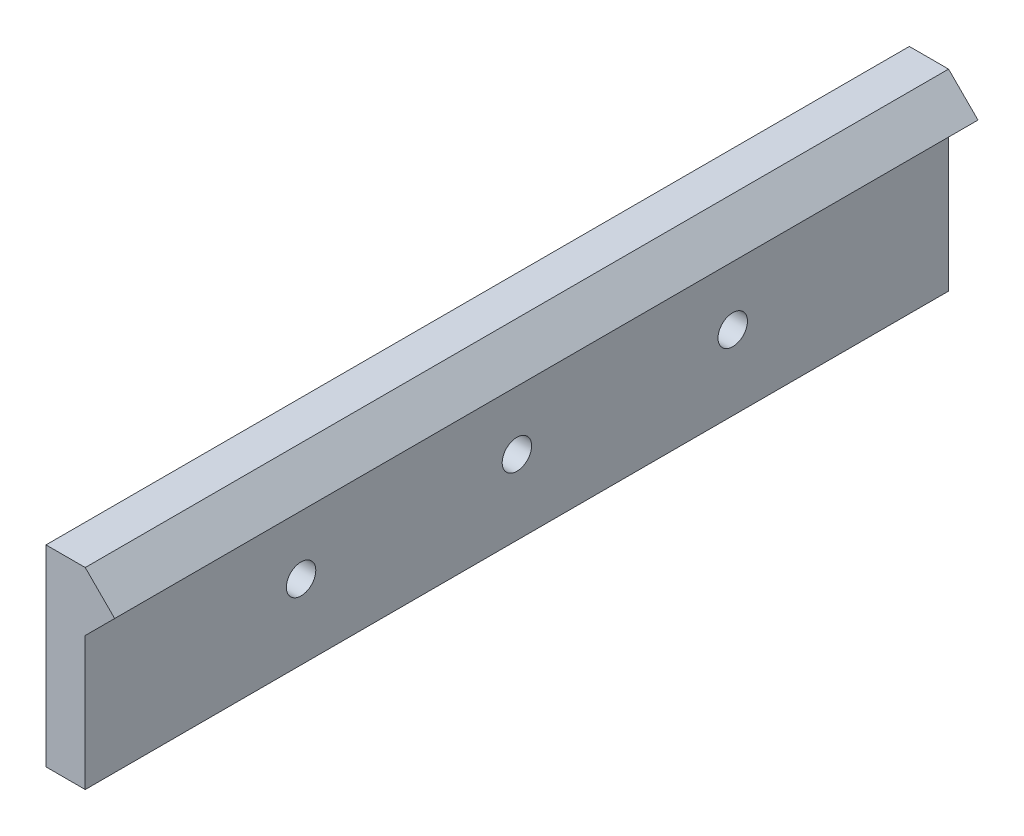
ISO-10303-21;
HEADER;
FILE_DESCRIPTION(('STEP AP214'),'2;1');
FILE_NAME('part.step','',(''),(''),'','','');
FILE_SCHEMA(('AUTOMOTIVE_DESIGN { 1 0 10303 214 1 1 1 1 }'));
ENDSEC;
DATA;
#1=APPLICATION_CONTEXT('core data for automotive mechanical design processes');
#2=APPLICATION_PROTOCOL_DEFINITION('international standard','automotive_design',2000,#1);
#3=PRODUCT_CONTEXT('',#1,'mechanical');
#4=PRODUCT('Part','Part','',(#3));
#5=PRODUCT_RELATED_PRODUCT_CATEGORY('part','',(#4));
#6=PRODUCT_DEFINITION_FORMATION('','',#4);
#7=PRODUCT_DEFINITION_CONTEXT('part definition',#1,'design');
#8=PRODUCT_DEFINITION('design','',#6,#7);
#9=PRODUCT_DEFINITION_SHAPE('','',#8);
#10=(LENGTH_UNIT() NAMED_UNIT(*) SI_UNIT(.MILLI.,.METRE.));
#11=(NAMED_UNIT(*) PLANE_ANGLE_UNIT() SI_UNIT($,.RADIAN.));
#12=(NAMED_UNIT(*) SI_UNIT($,.STERADIAN.) SOLID_ANGLE_UNIT());
#13=UNCERTAINTY_MEASURE_WITH_UNIT(LENGTH_MEASURE(1.E-05),#10,'distance_accuracy_value','');
#14=(GEOMETRIC_REPRESENTATION_CONTEXT(3) GLOBAL_UNCERTAINTY_ASSIGNED_CONTEXT((#13)) GLOBAL_UNIT_ASSIGNED_CONTEXT((#10,
#11,#12)) REPRESENTATION_CONTEXT('',''));
#15=CARTESIAN_POINT('',(0.,0.,0.));
#16=DIRECTION('',(0.,0.,1.));
#17=DIRECTION('',(1.,0.,0.));
#18=AXIS2_PLACEMENT_3D('',#15,#16,#17);
#19=CARTESIAN_POINT('',(6.35000000000002,44.45,139.7));
#20=DIRECTION('',(-1.,0.,0.));
#21=DIRECTION('',(0.,-1.,0.));
#22=AXIS2_PLACEMENT_3D('',#19,#20,#21);
#23=PLANE('',#22);
#24=CARTESIAN_POINT('',(6.35000000000002,25.4,69.85));
#25=DIRECTION('',(-1.,0.,0.));
#26=DIRECTION('',(0.,-1.,0.));
#27=AXIS2_PLACEMENT_3D('',#24,#25,#26);
#28=CIRCLE('',#27,4.7625);
#29=CARTESIAN_POINT('',(6.35000000000002,25.4,65.0875));
#30=VERTEX_POINT('',#29);
#31=EDGE_CURVE('E126',#30,#30,#28,.T.);
#32=ORIENTED_EDGE('',*,*,#31,.T.);
#33=EDGE_LOOP('',(#32));
#34=FACE_BOUND('',#33,.T.);
#35=CARTESIAN_POINT('',(6.35000000000002,25.4,0.));
#36=DIRECTION('',(-1.,0.,0.));
#37=DIRECTION('',(0.,-1.,0.));
#38=AXIS2_PLACEMENT_3D('',#35,#36,#37);
#39=CIRCLE('',#38,4.7625);
#40=CARTESIAN_POINT('',(6.35000000000002,25.4,-4.76250000000003));
#41=VERTEX_POINT('',#40);
#42=EDGE_CURVE('E144',#41,#41,#39,.T.);
#43=ORIENTED_EDGE('',*,*,#42,.T.);
#44=EDGE_LOOP('',(#43));
#45=FACE_BOUND('',#44,.T.);
#46=CARTESIAN_POINT('',(6.35000000000002,25.4,-69.85));
#47=DIRECTION('',(-1.,0.,0.));
#48=DIRECTION('',(0.,-1.,0.));
#49=AXIS2_PLACEMENT_3D('',#46,#47,#48);
#50=CIRCLE('',#49,4.7625);
#51=CARTESIAN_POINT('',(6.35000000000002,25.4,-74.6125));
#52=VERTEX_POINT('',#51);
#53=EDGE_CURVE('E141',#52,#52,#50,.T.);
#54=ORIENTED_EDGE('',*,*,#53,.T.);
#55=EDGE_LOOP('',(#54));
#56=FACE_BOUND('',#55,.T.);
#57=DIRECTION('',(0.,1.,0.));
#58=VECTOR('',#57,1.);
#59=CARTESIAN_POINT('',(6.35000000000002,44.45,-139.7));
#60=LINE('',#59,#58);
#61=CARTESIAN_POINT('',(6.35000000000002,1.27,-139.7));
#62=VERTEX_POINT('',#61);
#63=CARTESIAN_POINT('',(6.35000000000002,44.45,-139.7));
#64=VERTEX_POINT('',#63);
#65=EDGE_CURVE('E122',#62,#64,#60,.T.);
#66=ORIENTED_EDGE('',*,*,#65,.T.);
#67=DIRECTION('',(0.,0.,-1.));
#68=VECTOR('',#67,1.);
#69=CARTESIAN_POINT('',(6.35000000000002,44.45,139.7));
#70=LINE('',#69,#68);
#71=CARTESIAN_POINT('',(6.35000000000002,44.45,139.7));
#72=VERTEX_POINT('',#71);
#73=EDGE_CURVE('E11',#72,#64,#70,.T.);
#74=ORIENTED_EDGE('',*,*,#73,.F.);
#75=DIRECTION('',(0.,1.,0.));
#76=VECTOR('',#75,1.);
#77=CARTESIAN_POINT('',(6.35000000000002,44.45,139.7));
#78=LINE('',#77,#76);
#79=CARTESIAN_POINT('',(6.35000000000002,1.27,139.7));
#80=VERTEX_POINT('',#79);
#81=EDGE_CURVE('E133',#80,#72,#78,.T.);
#82=ORIENTED_EDGE('',*,*,#81,.F.);
#83=DIRECTION('',(0.,0.,-1.));
#84=VECTOR('',#83,1.);
#85=CARTESIAN_POINT('',(6.35000000000002,1.27,139.7));
#86=LINE('',#85,#84);
#87=EDGE_CURVE('E118',#80,#62,#86,.T.);
#88=ORIENTED_EDGE('',*,*,#87,.T.);
#89=EDGE_LOOP('',(#66,#74,#82,#88));
#90=FACE_BOUND('',#89,.T.);
#91=ADVANCED_FACE('F36',(#34,#45,#56,#90),#23,.F.);
#92=CARTESIAN_POINT('',(6.35000000000002,44.45,139.7));
#93=DIRECTION('',(-0.707106781186552,0.707106781186543,0.));
#94=DIRECTION('',(-0.707106781186543,-0.707106781186552,0.));
#95=AXIS2_PLACEMENT_3D('',#92,#93,#94);
#96=PLANE('',#95);
#97=DIRECTION('',(0.707106781186543,0.707106781186552,0.));
#98=VECTOR('',#97,1.);
#99=CARTESIAN_POINT('',(6.35000000000002,44.45,-139.7));
#100=LINE('',#99,#98);
#101=CARTESIAN_POINT('',(15.8749999999999,53.975,-139.7));
#102=VERTEX_POINT('',#101);
#103=EDGE_CURVE('E125',#64,#102,#100,.T.);
#104=ORIENTED_EDGE('',*,*,#103,.T.);
#105=DIRECTION('',(0.,0.,-1.));
#106=VECTOR('',#105,1.);
#107=CARTESIAN_POINT('',(15.8749999999999,53.975,139.7));
#108=LINE('',#107,#106);
#109=CARTESIAN_POINT('',(15.8749999999999,53.975,139.7));
#110=VERTEX_POINT('',#109);
#111=EDGE_CURVE('E45',#110,#102,#108,.T.);
#112=ORIENTED_EDGE('',*,*,#111,.F.);
#113=DIRECTION('',(0.707106781186543,0.707106781186552,0.));
#114=VECTOR('',#113,1.);
#115=CARTESIAN_POINT('',(6.35000000000002,44.45,139.7));
#116=LINE('',#115,#114);
#117=EDGE_CURVE('E91',#72,#110,#116,.T.);
#118=ORIENTED_EDGE('',*,*,#117,.F.);
#119=ORIENTED_EDGE('',*,*,#73,.T.);
#120=EDGE_LOOP('',(#104,#112,#118,#119));
#121=FACE_BOUND('',#120,.T.);
#122=ADVANCED_FACE('F159',(#121),#96,.F.);
#123=CARTESIAN_POINT('',(6.35000000000002,63.5,139.7));
#124=DIRECTION('',(-0.707106781186549,-0.707106781186546,0.));
#125=DIRECTION('',(0.707106781186546,-0.707106781186549,0.));
#126=AXIS2_PLACEMENT_3D('',#123,#124,#125);
#127=PLANE('',#126);
#128=DIRECTION('',(-0.707106781186546,0.707106781186549,0.));
#129=VECTOR('',#128,1.);
#130=CARTESIAN_POINT('',(6.35000000000002,63.5,-139.7));
#131=LINE('',#130,#129);
#132=CARTESIAN_POINT('',(6.35000000000002,63.5,-139.7));
#133=VERTEX_POINT('',#132);
#134=EDGE_CURVE('E128',#102,#133,#131,.T.);
#135=ORIENTED_EDGE('',*,*,#134,.T.);
#136=DIRECTION('',(0.,0.,-1.));
#137=VECTOR('',#136,1.);
#138=CARTESIAN_POINT('',(6.35000000000002,63.5,139.7));
#139=LINE('',#138,#137);
#140=CARTESIAN_POINT('',(6.35000000000002,63.5,139.7));
#141=VERTEX_POINT('',#140);
#142=EDGE_CURVE('E113',#141,#133,#139,.T.);
#143=ORIENTED_EDGE('',*,*,#142,.F.);
#144=DIRECTION('',(-0.707106781186546,0.707106781186549,0.));
#145=VECTOR('',#144,1.);
#146=CARTESIAN_POINT('',(6.35000000000002,63.5,139.7));
#147=LINE('',#146,#145);
#148=EDGE_CURVE('E104',#110,#141,#147,.T.);
#149=ORIENTED_EDGE('',*,*,#148,.F.);
#150=ORIENTED_EDGE('',*,*,#111,.T.);
#151=EDGE_LOOP('',(#135,#143,#149,#150));
#152=FACE_BOUND('',#151,.T.);
#153=ADVANCED_FACE('F162',(#152),#127,.F.);
#154=CARTESIAN_POINT('',(-6.34999999999997,63.5,139.7));
#155=DIRECTION('',(0.,-1.,0.));
#156=DIRECTION('',(0.,0.,-1.));
#157=AXIS2_PLACEMENT_3D('',#154,#155,#156);
#158=PLANE('',#157);
#159=DIRECTION('',(-1.,0.,0.));
#160=VECTOR('',#159,1.);
#161=CARTESIAN_POINT('',(-6.34999999999997,63.5,-139.7));
#162=LINE('',#161,#160);
#163=CARTESIAN_POINT('',(-6.34999999999997,63.5,-139.7));
#164=VERTEX_POINT('',#163);
#165=EDGE_CURVE('E112',#133,#164,#162,.T.);
#166=ORIENTED_EDGE('',*,*,#165,.T.);
#167=DIRECTION('',(0.,0.,-1.));
#168=VECTOR('',#167,1.);
#169=CARTESIAN_POINT('',(-6.34999999999997,63.5,139.7));
#170=LINE('',#169,#168);
#171=CARTESIAN_POINT('',(-6.34999999999997,63.5,139.7));
#172=VERTEX_POINT('',#171);
#173=EDGE_CURVE('E109',#172,#164,#170,.T.);
#174=ORIENTED_EDGE('',*,*,#173,.F.);
#175=DIRECTION('',(-1.,0.,0.));
#176=VECTOR('',#175,1.);
#177=CARTESIAN_POINT('',(-6.34999999999997,63.5,139.7));
#178=LINE('',#177,#176);
#179=EDGE_CURVE('E98',#141,#172,#178,.T.);
#180=ORIENTED_EDGE('',*,*,#179,.F.);
#181=ORIENTED_EDGE('',*,*,#142,.T.);
#182=EDGE_LOOP('',(#166,#174,#180,#181));
#183=FACE_BOUND('',#182,.T.);
#184=ADVANCED_FACE('F110',(#183),#158,.F.);
#185=CARTESIAN_POINT('',(-6.34999999999997,1.27,139.7));
#186=DIRECTION('',(1.,0.,0.));
#187=DIRECTION('',(0.,1.,0.));
#188=AXIS2_PLACEMENT_3D('',#185,#186,#187);
#189=PLANE('',#188);
#190=CARTESIAN_POINT('',(-6.34999999999997,25.4,69.85));
#191=DIRECTION('',(1.,0.,0.));
#192=DIRECTION('',(0.,1.,0.));
#193=AXIS2_PLACEMENT_3D('',#190,#191,#192);
#194=CIRCLE('',#193,4.7625);
#195=CARTESIAN_POINT('',(-6.34999999999998,25.4,65.0875));
#196=VERTEX_POINT('',#195);
#197=EDGE_CURVE('E39',#196,#196,#194,.T.);
#198=ORIENTED_EDGE('',*,*,#197,.T.);
#199=EDGE_LOOP('',(#198));
#200=FACE_BOUND('',#199,.T.);
#201=CARTESIAN_POINT('',(-6.34999999999997,25.4,0.));
#202=DIRECTION('',(1.,0.,0.));
#203=DIRECTION('',(0.,1.,0.));
#204=AXIS2_PLACEMENT_3D('',#201,#202,#203);
#205=CIRCLE('',#204,4.7625);
#206=CARTESIAN_POINT('',(-6.34999999999998,25.4,-4.76250000000003));
#207=VERTEX_POINT('',#206);
#208=EDGE_CURVE('E142',#207,#207,#205,.T.);
#209=ORIENTED_EDGE('',*,*,#208,.T.);
#210=EDGE_LOOP('',(#209));
#211=FACE_BOUND('',#210,.T.);
#212=CARTESIAN_POINT('',(-6.34999999999997,25.4,-69.85));
#213=DIRECTION('',(1.,0.,0.));
#214=DIRECTION('',(0.,1.,0.));
#215=AXIS2_PLACEMENT_3D('',#212,#213,#214);
#216=CIRCLE('',#215,4.7625);
#217=CARTESIAN_POINT('',(-6.34999999999998,25.4,-74.6125));
#218=VERTEX_POINT('',#217);
#219=EDGE_CURVE('E139',#218,#218,#216,.T.);
#220=ORIENTED_EDGE('',*,*,#219,.T.);
#221=EDGE_LOOP('',(#220));
#222=FACE_BOUND('',#221,.T.);
#223=DIRECTION('',(0.,-1.,0.));
#224=VECTOR('',#223,1.);
#225=CARTESIAN_POINT('',(-6.34999999999997,1.27,-139.7));
#226=LINE('',#225,#224);
#227=CARTESIAN_POINT('',(-6.34999999999997,1.27,-139.7));
#228=VERTEX_POINT('',#227);
#229=EDGE_CURVE('E77',#164,#228,#226,.T.);
#230=ORIENTED_EDGE('',*,*,#229,.T.);
#231=DIRECTION('',(0.,0.,-1.));
#232=VECTOR('',#231,1.);
#233=CARTESIAN_POINT('',(-6.34999999999997,1.27,139.7));
#234=LINE('',#233,#232);
#235=CARTESIAN_POINT('',(-6.34999999999997,1.27,139.7));
#236=VERTEX_POINT('',#235);
#237=EDGE_CURVE('E114',#236,#228,#234,.T.);
#238=ORIENTED_EDGE('',*,*,#237,.F.);
#239=DIRECTION('',(0.,-1.,0.));
#240=VECTOR('',#239,1.);
#241=CARTESIAN_POINT('',(-6.34999999999997,1.27,139.7));
#242=LINE('',#241,#240);
#243=EDGE_CURVE('E102',#172,#236,#242,.T.);
#244=ORIENTED_EDGE('',*,*,#243,.F.);
#245=ORIENTED_EDGE('',*,*,#173,.T.);
#246=EDGE_LOOP('',(#230,#238,#244,#245));
#247=FACE_BOUND('',#246,.T.);
#248=ADVANCED_FACE('F116',(#200,#211,#222,#247),#189,.F.);
#249=CARTESIAN_POINT('',(-6.34999999999997,1.27,139.7));
#250=DIRECTION('',(0.,1.,0.));
#251=DIRECTION('',(-1.,0.,0.));
#252=AXIS2_PLACEMENT_3D('',#249,#250,#251);
#253=PLANE('',#252);
#254=DIRECTION('',(1.,0.,0.));
#255=VECTOR('',#254,1.);
#256=CARTESIAN_POINT('',(-6.34999999999997,1.27,-139.7));
#257=LINE('',#256,#255);
#258=EDGE_CURVE('E83',#228,#62,#257,.T.);
#259=ORIENTED_EDGE('',*,*,#258,.T.);
#260=ORIENTED_EDGE('',*,*,#87,.F.);
#261=DIRECTION('',(1.,0.,0.));
#262=VECTOR('',#261,1.);
#263=CARTESIAN_POINT('',(-6.34999999999997,1.27,139.7));
#264=LINE('',#263,#262);
#265=EDGE_CURVE('E54',#236,#80,#264,.T.);
#266=ORIENTED_EDGE('',*,*,#265,.F.);
#267=ORIENTED_EDGE('',*,*,#237,.T.);
#268=EDGE_LOOP('',(#259,#260,#266,#267));
#269=FACE_BOUND('',#268,.T.);
#270=ADVANCED_FACE('F167',(#269),#253,.F.);
#271=CARTESIAN_POINT('',(0.,0.,139.7));
#272=DIRECTION('',(0.,0.,1.));
#273=DIRECTION('',(1.,0.,0.));
#274=AXIS2_PLACEMENT_3D('',#271,#272,#273);
#275=PLANE('',#274);
#276=ORIENTED_EDGE('',*,*,#81,.T.);
#277=ORIENTED_EDGE('',*,*,#117,.T.);
#278=ORIENTED_EDGE('',*,*,#148,.T.);
#279=ORIENTED_EDGE('',*,*,#179,.T.);
#280=ORIENTED_EDGE('',*,*,#243,.T.);
#281=ORIENTED_EDGE('',*,*,#265,.T.);
#282=EDGE_LOOP('',(#276,#277,#278,#279,#280,#281));
#283=FACE_BOUND('',#282,.T.);
#284=ADVANCED_FACE('F100',(#283),#275,.T.);
#285=CARTESIAN_POINT('',(0.,0.,-139.7));
#286=DIRECTION('',(0.,0.,1.));
#287=DIRECTION('',(1.,0.,0.));
#288=AXIS2_PLACEMENT_3D('',#285,#286,#287);
#289=PLANE('',#288);
#290=ORIENTED_EDGE('',*,*,#65,.F.);
#291=ORIENTED_EDGE('',*,*,#258,.F.);
#292=ORIENTED_EDGE('',*,*,#229,.F.);
#293=ORIENTED_EDGE('',*,*,#165,.F.);
#294=ORIENTED_EDGE('',*,*,#134,.F.);
#295=ORIENTED_EDGE('',*,*,#103,.F.);
#296=EDGE_LOOP('',(#290,#291,#292,#293,#294,#295));
#297=FACE_BOUND('',#296,.T.);
#298=ADVANCED_FACE('F165',(#297),#289,.F.);
#299=CARTESIAN_POINT('',(-38.1,25.4,-69.85));
#300=DIRECTION('',(1.,0.,0.));
#301=DIRECTION('',(0.,0.,-1.));
#302=AXIS2_PLACEMENT_3D('',#299,#300,#301);
#303=CYLINDRICAL_SURFACE('',#302,4.7625);
#304=CARTESIAN_POINT('',(-6.34999999999998,25.4,-74.6125));
#305=CARTESIAN_POINT('',(-6.21770833333331,25.4,-74.6125));
#306=CARTESIAN_POINT('',(-6.08541666666665,25.4,-74.6125));
#307=CARTESIAN_POINT('',(-5.82083333333331,25.4,-74.6125));
#308=CARTESIAN_POINT('',(-5.68854166666665,25.4,-74.6125));
#309=CARTESIAN_POINT('',(-5.42395833333331,25.4,-74.6125));
#310=CARTESIAN_POINT('',(-5.29166666666665,25.4,-74.6125));
#311=CARTESIAN_POINT('',(-5.02708333333331,25.4,-74.6125));
#312=CARTESIAN_POINT('',(-4.89479166666665,25.4,-74.6125));
#313=CARTESIAN_POINT('',(-4.63020833333331,25.4,-74.6125));
#314=CARTESIAN_POINT('',(-4.49791666666665,25.4,-74.6125));
#315=CARTESIAN_POINT('',(-4.23333333333331,25.4,-74.6125));
#316=CARTESIAN_POINT('',(-4.10104166666664,25.4,-74.6125));
#317=CARTESIAN_POINT('',(-3.83645833333331,25.4,-74.6125));
#318=CARTESIAN_POINT('',(-3.70416666666665,25.4,-74.6125));
#319=CARTESIAN_POINT('',(-3.43958333333332,25.4,-74.6125));
#320=CARTESIAN_POINT('',(-3.30729166666665,25.4,-74.6125));
#321=CARTESIAN_POINT('',(-3.04270833333332,25.4,-74.6125));
#322=CARTESIAN_POINT('',(-2.91041666666665,25.4,-74.6125));
#323=CARTESIAN_POINT('',(-2.64583333333331,25.4,-74.6125));
#324=CARTESIAN_POINT('',(-2.51354166666665,25.4,-74.6125));
#325=CARTESIAN_POINT('',(-2.24895833333331,25.4,-74.6125));
#326=CARTESIAN_POINT('',(-2.11666666666665,25.4,-74.6125));
#327=CARTESIAN_POINT('',(-1.85208333333331,25.4,-74.6125));
#328=CARTESIAN_POINT('',(-1.71979166666665,25.4,-74.6125));
#329=CARTESIAN_POINT('',(-1.45520833333331,25.4,-74.6125));
#330=CARTESIAN_POINT('',(-1.32291666666665,25.4,-74.6125));
#331=CARTESIAN_POINT('',(-1.05833333333331,25.4,-74.6125));
#332=CARTESIAN_POINT('',(-0.926041666666648,25.4,-74.6125));
#333=CARTESIAN_POINT('',(-0.661458333333314,25.4,-74.6125));
#334=CARTESIAN_POINT('',(-0.529166666666645,25.4,-74.6125));
#335=CARTESIAN_POINT('',(-0.264583333333311,25.4,-74.6125));
#336=CARTESIAN_POINT('',(-0.132291666666645,25.4,-74.6125));
#337=CARTESIAN_POINT('',(0.132291666666687,25.4,-74.6125));
#338=CARTESIAN_POINT('',(0.264583333333353,25.4,-74.6125));
#339=CARTESIAN_POINT('',(0.529166666666687,25.4,-74.6125));
#340=CARTESIAN_POINT('',(0.661458333333355,25.4,-74.6125));
#341=CARTESIAN_POINT('',(0.92604166666669,25.4,-74.6125));
#342=CARTESIAN_POINT('',(1.05833333333336,25.4,-74.6125));
#343=CARTESIAN_POINT('',(1.32291666666669,25.4,-74.6125));
#344=CARTESIAN_POINT('',(1.45520833333335,25.4,-74.6125));
#345=CARTESIAN_POINT('',(1.71979166666669,25.4,-74.6125));
#346=CARTESIAN_POINT('',(1.85208333333336,25.4,-74.6125));
#347=CARTESIAN_POINT('',(2.11666666666669,25.4,-74.6125));
#348=CARTESIAN_POINT('',(2.24895833333336,25.4,-74.6125));
#349=CARTESIAN_POINT('',(2.51354166666669,25.4,-74.6125));
#350=CARTESIAN_POINT('',(2.64583333333335,25.4,-74.6125));
#351=CARTESIAN_POINT('',(2.91041666666669,25.4,-74.6125));
#352=CARTESIAN_POINT('',(3.04270833333336,25.4,-74.6125));
#353=CARTESIAN_POINT('',(3.30729166666669,25.4,-74.6125));
#354=CARTESIAN_POINT('',(3.43958333333336,25.4,-74.6125));
#355=CARTESIAN_POINT('',(3.70416666666669,25.4,-74.6125));
#356=CARTESIAN_POINT('',(3.83645833333336,25.4,-74.6125));
#357=CARTESIAN_POINT('',(4.10104166666669,25.4,-74.6125));
#358=CARTESIAN_POINT('',(4.23333333333336,25.4,-74.6125));
#359=CARTESIAN_POINT('',(4.49791666666669,25.4,-74.6125));
#360=CARTESIAN_POINT('',(4.63020833333336,25.4,-74.6125));
#361=CARTESIAN_POINT('',(4.89479166666669,25.4,-74.6125));
#362=CARTESIAN_POINT('',(5.02708333333336,25.4,-74.6125));
#363=CARTESIAN_POINT('',(5.29166666666669,25.4,-74.6125));
#364=CARTESIAN_POINT('',(5.42395833333336,25.4,-74.6125));
#365=CARTESIAN_POINT('',(5.68854166666669,25.4,-74.6125));
#366=CARTESIAN_POINT('',(5.82083333333336,25.4,-74.6125));
#367=CARTESIAN_POINT('',(6.08541666666669,25.4,-74.6125));
#368=CARTESIAN_POINT('',(6.21770833333336,25.4,-74.6125));
#369=CARTESIAN_POINT('',(6.35000000000002,25.4,-74.6125));
#370=B_SPLINE_CURVE_WITH_KNOTS('',3,(#304,#305,#306,#307,#308,#309,#310,#311,#312,#313,#314,
#315,#316,#317,#318,#319,#320,#321,#322,#323,#324,#325,#326,#327,#328,#329,#330,#331,#332,#333,
#334,#335,#336,#337,#338,#339,#340,#341,#342,#343,#344,#345,#346,#347,#348,#349,#350,#351,#352,
#353,#354,#355,#356,#357,#358,#359,#360,#361,#362,#363,#364,#365,#366,#367,#368,#369),
.UNSPECIFIED.,.F.,.F.,(4,2,2,2,2,2,2,2,2,2,2,2,2,2,2,2,2,2,2,2,2,2,2,2,2,2,2,2,2,2,2,2,4),(0.,
0.396874999999998,0.793750000000003,1.190625,1.5875,1.984375,2.38125,2.778125,3.175,3.571875,
3.96875,4.365625,4.7625,5.159375,5.55625,5.953125,6.35,6.746875,7.14375,7.540625,7.9375,
8.334375,8.73125,9.128125,9.52500000000001,9.921875,10.31875,10.715625,11.1125,11.509375,
11.90625,12.303125,12.7),.UNSPECIFIED.);
#371=EDGE_CURVE('BSEAM190',#218,#52,#370,.T.);
#372=ORIENTED_EDGE('',*,*,#219,.F.);
#373=ORIENTED_EDGE('',*,*,#53,.F.);
#374=ORIENTED_EDGE('',*,*,#371,.T.);
#375=ORIENTED_EDGE('',*,*,#371,.F.);
#376=EDGE_LOOP('',(#372,#374,#373,#375));
#377=FACE_BOUND('',#376,.T.);
#378=ADVANCED_FACE('F190',(#377),#303,.F.);
#379=CARTESIAN_POINT('',(-38.1,25.4,0.));
#380=DIRECTION('',(1.,0.,0.));
#381=DIRECTION('',(0.,0.,-1.));
#382=AXIS2_PLACEMENT_3D('',#379,#380,#381);
#383=CYLINDRICAL_SURFACE('',#382,4.7625);
#384=CARTESIAN_POINT('',(-6.34999999999998,25.4,-4.76250000000003));
#385=CARTESIAN_POINT('',(-6.21770833333331,25.4,-4.76250000000003));
#386=CARTESIAN_POINT('',(-6.08541666666665,25.4,-4.76250000000003));
#387=CARTESIAN_POINT('',(-5.82083333333331,25.4,-4.76250000000003));
#388=CARTESIAN_POINT('',(-5.68854166666665,25.4,-4.76250000000003));
#389=CARTESIAN_POINT('',(-5.42395833333331,25.4,-4.76250000000003));
#390=CARTESIAN_POINT('',(-5.29166666666665,25.4,-4.76250000000003));
#391=CARTESIAN_POINT('',(-5.02708333333331,25.4,-4.76250000000003));
#392=CARTESIAN_POINT('',(-4.89479166666665,25.4,-4.76250000000003));
#393=CARTESIAN_POINT('',(-4.63020833333331,25.4,-4.76250000000003));
#394=CARTESIAN_POINT('',(-4.49791666666665,25.4,-4.76250000000003));
#395=CARTESIAN_POINT('',(-4.23333333333331,25.4,-4.76250000000003));
#396=CARTESIAN_POINT('',(-4.10104166666664,25.4,-4.76250000000003));
#397=CARTESIAN_POINT('',(-3.83645833333331,25.4,-4.76250000000003));
#398=CARTESIAN_POINT('',(-3.70416666666665,25.4,-4.76250000000003));
#399=CARTESIAN_POINT('',(-3.43958333333332,25.4,-4.76250000000003));
#400=CARTESIAN_POINT('',(-3.30729166666665,25.4,-4.76250000000003));
#401=CARTESIAN_POINT('',(-3.04270833333332,25.4,-4.76250000000003));
#402=CARTESIAN_POINT('',(-2.91041666666665,25.4,-4.76250000000003));
#403=CARTESIAN_POINT('',(-2.64583333333331,25.4,-4.76250000000003));
#404=CARTESIAN_POINT('',(-2.51354166666665,25.4,-4.76250000000003));
#405=CARTESIAN_POINT('',(-2.24895833333331,25.4,-4.76250000000003));
#406=CARTESIAN_POINT('',(-2.11666666666665,25.4,-4.76250000000003));
#407=CARTESIAN_POINT('',(-1.85208333333331,25.4,-4.76250000000003));
#408=CARTESIAN_POINT('',(-1.71979166666665,25.4,-4.76250000000003));
#409=CARTESIAN_POINT('',(-1.45520833333331,25.4,-4.76250000000003));
#410=CARTESIAN_POINT('',(-1.32291666666665,25.4,-4.76250000000003));
#411=CARTESIAN_POINT('',(-1.05833333333331,25.4,-4.76250000000003));
#412=CARTESIAN_POINT('',(-0.926041666666648,25.4,-4.76250000000003));
#413=CARTESIAN_POINT('',(-0.661458333333314,25.4,-4.76250000000003));
#414=CARTESIAN_POINT('',(-0.529166666666645,25.4,-4.76250000000003));
#415=CARTESIAN_POINT('',(-0.264583333333311,25.4,-4.76250000000003));
#416=CARTESIAN_POINT('',(-0.132291666666645,25.4,-4.76250000000003));
#417=CARTESIAN_POINT('',(0.132291666666687,25.4,-4.76250000000003));
#418=CARTESIAN_POINT('',(0.264583333333353,25.4,-4.76250000000003));
#419=CARTESIAN_POINT('',(0.529166666666687,25.4,-4.76250000000003));
#420=CARTESIAN_POINT('',(0.661458333333355,25.4,-4.76250000000003));
#421=CARTESIAN_POINT('',(0.92604166666669,25.4,-4.76250000000003));
#422=CARTESIAN_POINT('',(1.05833333333336,25.4,-4.76250000000003));
#423=CARTESIAN_POINT('',(1.32291666666669,25.4,-4.76250000000003));
#424=CARTESIAN_POINT('',(1.45520833333335,25.4,-4.76250000000003));
#425=CARTESIAN_POINT('',(1.71979166666669,25.4,-4.76250000000003));
#426=CARTESIAN_POINT('',(1.85208333333336,25.4,-4.76250000000003));
#427=CARTESIAN_POINT('',(2.11666666666669,25.4,-4.76250000000003));
#428=CARTESIAN_POINT('',(2.24895833333336,25.4,-4.76250000000003));
#429=CARTESIAN_POINT('',(2.51354166666669,25.4,-4.76250000000003));
#430=CARTESIAN_POINT('',(2.64583333333335,25.4,-4.76250000000003));
#431=CARTESIAN_POINT('',(2.91041666666669,25.4,-4.76250000000003));
#432=CARTESIAN_POINT('',(3.04270833333336,25.4,-4.76250000000003));
#433=CARTESIAN_POINT('',(3.30729166666669,25.4,-4.76250000000003));
#434=CARTESIAN_POINT('',(3.43958333333336,25.4,-4.76250000000003));
#435=CARTESIAN_POINT('',(3.70416666666669,25.4,-4.76250000000003));
#436=CARTESIAN_POINT('',(3.83645833333336,25.4,-4.76250000000003));
#437=CARTESIAN_POINT('',(4.10104166666669,25.4,-4.76250000000003));
#438=CARTESIAN_POINT('',(4.23333333333336,25.4,-4.76250000000003));
#439=CARTESIAN_POINT('',(4.49791666666669,25.4,-4.76250000000003));
#440=CARTESIAN_POINT('',(4.63020833333336,25.4,-4.76250000000003));
#441=CARTESIAN_POINT('',(4.89479166666669,25.4,-4.76250000000003));
#442=CARTESIAN_POINT('',(5.02708333333336,25.4,-4.76250000000003));
#443=CARTESIAN_POINT('',(5.29166666666669,25.4,-4.76250000000003));
#444=CARTESIAN_POINT('',(5.42395833333336,25.4,-4.76250000000003));
#445=CARTESIAN_POINT('',(5.68854166666669,25.4,-4.76250000000003));
#446=CARTESIAN_POINT('',(5.82083333333336,25.4,-4.76250000000003));
#447=CARTESIAN_POINT('',(6.08541666666669,25.4,-4.76250000000003));
#448=CARTESIAN_POINT('',(6.21770833333336,25.4,-4.76250000000003));
#449=CARTESIAN_POINT('',(6.35000000000002,25.4,-4.76250000000003));
#450=B_SPLINE_CURVE_WITH_KNOTS('',3,(#384,#385,#386,#387,#388,#389,#390,#391,#392,#393,#394,
#395,#396,#397,#398,#399,#400,#401,#402,#403,#404,#405,#406,#407,#408,#409,#410,#411,#412,#413,
#414,#415,#416,#417,#418,#419,#420,#421,#422,#423,#424,#425,#426,#427,#428,#429,#430,#431,#432,
#433,#434,#435,#436,#437,#438,#439,#440,#441,#442,#443,#444,#445,#446,#447,#448,#449),
.UNSPECIFIED.,.F.,.F.,(4,2,2,2,2,2,2,2,2,2,2,2,2,2,2,2,2,2,2,2,2,2,2,2,2,2,2,2,2,2,2,2,4),(0.,
0.396874999999998,0.793750000000003,1.190625,1.5875,1.984375,2.38125,2.778125,3.175,3.571875,
3.96875,4.365625,4.7625,5.159375,5.55625,5.953125,6.35,6.746875,7.14375,7.540625,7.9375,
8.334375,8.73125,9.128125,9.52500000000001,9.921875,10.31875,10.715625,11.1125,11.509375,
11.90625,12.303125,12.7),.UNSPECIFIED.);
#451=EDGE_CURVE('BSEAM187',#207,#41,#450,.T.);
#452=ORIENTED_EDGE('',*,*,#208,.F.);
#453=ORIENTED_EDGE('',*,*,#42,.F.);
#454=ORIENTED_EDGE('',*,*,#451,.T.);
#455=ORIENTED_EDGE('',*,*,#451,.F.);
#456=EDGE_LOOP('',(#452,#454,#453,#455));
#457=FACE_BOUND('',#456,.T.);
#458=ADVANCED_FACE('F187',(#457),#383,.F.);
#459=CARTESIAN_POINT('',(-38.1,25.4,69.85));
#460=DIRECTION('',(1.,0.,0.));
#461=DIRECTION('',(0.,0.,-1.));
#462=AXIS2_PLACEMENT_3D('',#459,#460,#461);
#463=CYLINDRICAL_SURFACE('',#462,4.7625);
#464=CARTESIAN_POINT('',(-6.34999999999998,25.4,65.0875));
#465=CARTESIAN_POINT('',(-6.21770833333331,25.4,65.0875));
#466=CARTESIAN_POINT('',(-6.08541666666665,25.4,65.0875));
#467=CARTESIAN_POINT('',(-5.82083333333331,25.4,65.0875));
#468=CARTESIAN_POINT('',(-5.68854166666665,25.4,65.0875));
#469=CARTESIAN_POINT('',(-5.42395833333331,25.4,65.0875));
#470=CARTESIAN_POINT('',(-5.29166666666665,25.4,65.0875));
#471=CARTESIAN_POINT('',(-5.02708333333331,25.4,65.0875));
#472=CARTESIAN_POINT('',(-4.89479166666665,25.4,65.0875));
#473=CARTESIAN_POINT('',(-4.63020833333331,25.4,65.0875));
#474=CARTESIAN_POINT('',(-4.49791666666665,25.4,65.0875));
#475=CARTESIAN_POINT('',(-4.23333333333331,25.4,65.0875));
#476=CARTESIAN_POINT('',(-4.10104166666664,25.4,65.0875));
#477=CARTESIAN_POINT('',(-3.83645833333331,25.4,65.0875));
#478=CARTESIAN_POINT('',(-3.70416666666665,25.4,65.0875));
#479=CARTESIAN_POINT('',(-3.43958333333332,25.4,65.0875));
#480=CARTESIAN_POINT('',(-3.30729166666665,25.4,65.0875));
#481=CARTESIAN_POINT('',(-3.04270833333332,25.4,65.0875));
#482=CARTESIAN_POINT('',(-2.91041666666665,25.4,65.0875));
#483=CARTESIAN_POINT('',(-2.64583333333331,25.4,65.0875));
#484=CARTESIAN_POINT('',(-2.51354166666665,25.4,65.0875));
#485=CARTESIAN_POINT('',(-2.24895833333331,25.4,65.0875));
#486=CARTESIAN_POINT('',(-2.11666666666665,25.4,65.0875));
#487=CARTESIAN_POINT('',(-1.85208333333331,25.4,65.0875));
#488=CARTESIAN_POINT('',(-1.71979166666665,25.4,65.0875));
#489=CARTESIAN_POINT('',(-1.45520833333331,25.4,65.0875));
#490=CARTESIAN_POINT('',(-1.32291666666665,25.4,65.0875));
#491=CARTESIAN_POINT('',(-1.05833333333331,25.4,65.0875));
#492=CARTESIAN_POINT('',(-0.926041666666648,25.4,65.0875));
#493=CARTESIAN_POINT('',(-0.661458333333314,25.4,65.0875));
#494=CARTESIAN_POINT('',(-0.529166666666645,25.4,65.0875));
#495=CARTESIAN_POINT('',(-0.264583333333311,25.4,65.0875));
#496=CARTESIAN_POINT('',(-0.132291666666645,25.4,65.0875));
#497=CARTESIAN_POINT('',(0.132291666666687,25.4,65.0875));
#498=CARTESIAN_POINT('',(0.264583333333353,25.4,65.0875));
#499=CARTESIAN_POINT('',(0.529166666666687,25.4,65.0875));
#500=CARTESIAN_POINT('',(0.661458333333355,25.4,65.0875));
#501=CARTESIAN_POINT('',(0.92604166666669,25.4,65.0875));
#502=CARTESIAN_POINT('',(1.05833333333336,25.4,65.0875));
#503=CARTESIAN_POINT('',(1.32291666666669,25.4,65.0875));
#504=CARTESIAN_POINT('',(1.45520833333335,25.4,65.0875));
#505=CARTESIAN_POINT('',(1.71979166666669,25.4,65.0875));
#506=CARTESIAN_POINT('',(1.85208333333336,25.4,65.0875));
#507=CARTESIAN_POINT('',(2.11666666666669,25.4,65.0875));
#508=CARTESIAN_POINT('',(2.24895833333336,25.4,65.0875));
#509=CARTESIAN_POINT('',(2.51354166666669,25.4,65.0875));
#510=CARTESIAN_POINT('',(2.64583333333335,25.4,65.0875));
#511=CARTESIAN_POINT('',(2.91041666666669,25.4,65.0875));
#512=CARTESIAN_POINT('',(3.04270833333336,25.4,65.0875));
#513=CARTESIAN_POINT('',(3.30729166666669,25.4,65.0875));
#514=CARTESIAN_POINT('',(3.43958333333336,25.4,65.0875));
#515=CARTESIAN_POINT('',(3.70416666666669,25.4,65.0875));
#516=CARTESIAN_POINT('',(3.83645833333336,25.4,65.0875));
#517=CARTESIAN_POINT('',(4.10104166666669,25.4,65.0875));
#518=CARTESIAN_POINT('',(4.23333333333336,25.4,65.0875));
#519=CARTESIAN_POINT('',(4.49791666666669,25.4,65.0875));
#520=CARTESIAN_POINT('',(4.63020833333336,25.4,65.0875));
#521=CARTESIAN_POINT('',(4.89479166666669,25.4,65.0875));
#522=CARTESIAN_POINT('',(5.02708333333336,25.4,65.0875));
#523=CARTESIAN_POINT('',(5.29166666666669,25.4,65.0875));
#524=CARTESIAN_POINT('',(5.42395833333336,25.4,65.0875));
#525=CARTESIAN_POINT('',(5.68854166666669,25.4,65.0875));
#526=CARTESIAN_POINT('',(5.82083333333336,25.4,65.0875));
#527=CARTESIAN_POINT('',(6.08541666666669,25.4,65.0875));
#528=CARTESIAN_POINT('',(6.21770833333336,25.4,65.0875));
#529=CARTESIAN_POINT('',(6.35000000000002,25.4,65.0875));
#530=B_SPLINE_CURVE_WITH_KNOTS('',3,(#464,#465,#466,#467,#468,#469,#470,#471,#472,#473,#474,
#475,#476,#477,#478,#479,#480,#481,#482,#483,#484,#485,#486,#487,#488,#489,#490,#491,#492,#493,
#494,#495,#496,#497,#498,#499,#500,#501,#502,#503,#504,#505,#506,#507,#508,#509,#510,#511,#512,
#513,#514,#515,#516,#517,#518,#519,#520,#521,#522,#523,#524,#525,#526,#527,#528,#529),
.UNSPECIFIED.,.F.,.F.,(4,2,2,2,2,2,2,2,2,2,2,2,2,2,2,2,2,2,2,2,2,2,2,2,2,2,2,2,2,2,2,2,4),(0.,
0.396874999999998,0.793750000000003,1.190625,1.5875,1.984375,2.38125,2.778125,3.175,3.571875,
3.96875,4.365625,4.7625,5.159375,5.55625,5.953125,6.35,6.746875,7.14375,7.540625,7.9375,
8.334375,8.73125,9.128125,9.52500000000001,9.921875,10.31875,10.715625,11.1125,11.509375,
11.90625,12.303125,12.7),.UNSPECIFIED.);
#531=EDGE_CURVE('BSEAM189',#196,#30,#530,.T.);
#532=ORIENTED_EDGE('',*,*,#197,.F.);
#533=ORIENTED_EDGE('',*,*,#31,.F.);
#534=ORIENTED_EDGE('',*,*,#531,.T.);
#535=ORIENTED_EDGE('',*,*,#531,.F.);
#536=EDGE_LOOP('',(#532,#534,#533,#535));
#537=FACE_BOUND('',#536,.T.);
#538=ADVANCED_FACE('F189',(#537),#463,.F.);
#539=CLOSED_SHELL('',(#91,#122,#153,#184,#248,#270,#284,#298,#378,#458,#538));
#540=MANIFOLD_SOLID_BREP('B2',#539);
#541=ADVANCED_BREP_SHAPE_REPRESENTATION('',(#18,#540),#14);
#542=SHAPE_DEFINITION_REPRESENTATION(#9,#541);
ENDSEC;
END-ISO-10303-21;
